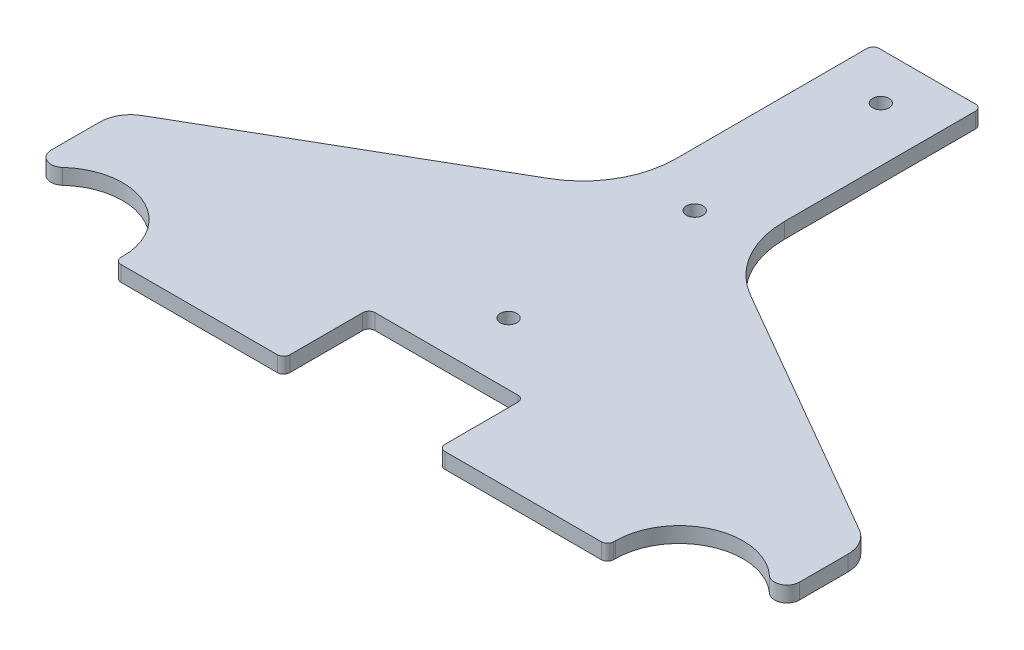
ISO-10303-21;
HEADER;
FILE_DESCRIPTION(('STEP AP214'),'2;1');
FILE_NAME('part.step','',(''),(''),'','','');
FILE_SCHEMA(('AUTOMOTIVE_DESIGN { 1 0 10303 214 1 1 1 1 }'));
ENDSEC;
DATA;
#1=APPLICATION_CONTEXT('core data for automotive mechanical design processes');
#2=APPLICATION_PROTOCOL_DEFINITION('international standard','automotive_design',2000,#1);
#3=PRODUCT_CONTEXT('',#1,'mechanical');
#4=PRODUCT('Part','Part','',(#3));
#5=PRODUCT_RELATED_PRODUCT_CATEGORY('part','',(#4));
#6=PRODUCT_DEFINITION_FORMATION('','',#4);
#7=PRODUCT_DEFINITION_CONTEXT('part definition',#1,'design');
#8=PRODUCT_DEFINITION('design','',#6,#7);
#9=PRODUCT_DEFINITION_SHAPE('','',#8);
#10=(LENGTH_UNIT() NAMED_UNIT(*) SI_UNIT(.MILLI.,.METRE.));
#11=(NAMED_UNIT(*) PLANE_ANGLE_UNIT() SI_UNIT($,.RADIAN.));
#12=(NAMED_UNIT(*) SI_UNIT($,.STERADIAN.) SOLID_ANGLE_UNIT());
#13=UNCERTAINTY_MEASURE_WITH_UNIT(LENGTH_MEASURE(1.E-05),#10,'distance_accuracy_value','');
#14=(GEOMETRIC_REPRESENTATION_CONTEXT(3) GLOBAL_UNCERTAINTY_ASSIGNED_CONTEXT((#13)) GLOBAL_UNIT_ASSIGNED_CONTEXT((#10,
#11,#12)) REPRESENTATION_CONTEXT('',''));
#15=CARTESIAN_POINT('',(0.,0.,0.));
#16=DIRECTION('',(0.,0.,1.));
#17=DIRECTION('',(1.,0.,0.));
#18=AXIS2_PLACEMENT_3D('',#15,#16,#17);
#19=CARTESIAN_POINT('',(-100.838,6.35,3.175));
#20=DIRECTION('',(0.,0.,-1.));
#21=DIRECTION('',(-1.,0.,0.));
#22=AXIS2_PLACEMENT_3D('',#19,#20,#21);
#23=PLANE('',#22);
#24=DIRECTION('',(1.,0.,0.));
#25=VECTOR('',#24,1.);
#26=CARTESIAN_POINT('',(-100.838,6.35,3.175));
#27=LINE('',#26,#25);
#28=CARTESIAN_POINT('',(-98.298,6.35,3.175));
#29=VERTEX_POINT('',#28);
#30=CARTESIAN_POINT('',(-34.29,6.35,3.175));
#31=VERTEX_POINT('',#30);
#32=EDGE_CURVE('E263',#29,#31,#27,.T.);
#33=ORIENTED_EDGE('',*,*,#32,.F.);
#34=DIRECTION('',(0.,-1.,0.));
#35=VECTOR('',#34,1.);
#36=CARTESIAN_POINT('',(-98.298,6.35,3.175));
#37=LINE('',#36,#35);
#38=CARTESIAN_POINT('',(-98.298,0.,3.175));
#39=VERTEX_POINT('',#38);
#40=EDGE_CURVE('E355',#29,#39,#37,.T.);
#41=ORIENTED_EDGE('',*,*,#40,.T.);
#42=DIRECTION('',(1.,0.,0.));
#43=VECTOR('',#42,1.);
#44=CARTESIAN_POINT('',(-100.838,0.,3.175));
#45=LINE('',#44,#43);
#46=CARTESIAN_POINT('',(-34.29,0.,3.175));
#47=VERTEX_POINT('',#46);
#48=EDGE_CURVE('E286',#39,#47,#45,.T.);
#49=ORIENTED_EDGE('',*,*,#48,.T.);
#50=DIRECTION('',(0.,1.,0.));
#51=VECTOR('',#50,1.);
#52=CARTESIAN_POINT('',(-34.29,6.35,3.175));
#53=LINE('',#52,#51);
#54=EDGE_CURVE('E352',#47,#31,#53,.T.);
#55=ORIENTED_EDGE('',*,*,#54,.T.);
#56=EDGE_LOOP('',(#33,#41,#49,#55));
#57=FACE_BOUND('',#56,.T.);
#58=ADVANCED_FACE('F35',(#57),#23,.F.);
#59=CARTESIAN_POINT('',(-22.225,6.35,-228.6));
#60=DIRECTION('',(1.,0.,0.));
#61=DIRECTION('',(0.,0.,-1.));
#62=AXIS2_PLACEMENT_3D('',#59,#60,#61);
#63=PLANE('',#62);
#64=DIRECTION('',(0.,0.,1.));
#65=VECTOR('',#64,1.);
#66=CARTESIAN_POINT('',(-22.225,0.,-228.6));
#67=LINE('',#66,#65);
#68=CARTESIAN_POINT('',(-22.225,0.,-226.06));
#69=VERTEX_POINT('',#68);
#70=CARTESIAN_POINT('',(-22.225,0.,-147.854946515533));
#71=VERTEX_POINT('',#70);
#72=EDGE_CURVE('E278',#69,#71,#67,.T.);
#73=ORIENTED_EDGE('',*,*,#72,.T.);
#74=DIRECTION('',(0.,1.,0.));
#75=VECTOR('',#74,1.);
#76=CARTESIAN_POINT('',(-22.225,6.35,-147.854946515533));
#77=LINE('',#76,#75);
#78=CARTESIAN_POINT('',(-22.225,6.35,-147.854946515533));
#79=VERTEX_POINT('',#78);
#80=EDGE_CURVE('E418',#71,#79,#77,.T.);
#81=ORIENTED_EDGE('',*,*,#80,.T.);
#82=DIRECTION('',(0.,0.,1.));
#83=VECTOR('',#82,1.);
#84=CARTESIAN_POINT('',(-22.225,6.35,-228.6));
#85=LINE('',#84,#83);
#86=CARTESIAN_POINT('',(-22.225,6.35,-226.06));
#87=VERTEX_POINT('',#86);
#88=EDGE_CURVE('E244',#87,#79,#85,.T.);
#89=ORIENTED_EDGE('',*,*,#88,.F.);
#90=DIRECTION('',(0.,-1.,0.));
#91=VECTOR('',#90,1.);
#92=CARTESIAN_POINT('',(-22.225,6.35,-226.06));
#93=LINE('',#92,#91);
#94=EDGE_CURVE('E367',#87,#69,#93,.T.);
#95=ORIENTED_EDGE('',*,*,#94,.T.);
#96=EDGE_LOOP('',(#73,#81,#89,#95));
#97=FACE_BOUND('',#96,.T.);
#98=ADVANCED_FACE('F463',(#97),#63,.F.);
#99=CARTESIAN_POINT('',(-127.,6.35,0.));
#100=DIRECTION('',(0.,-1.,0.));
#101=DIRECTION('',(0.,0.,-1.));
#102=AXIS2_PLACEMENT_3D('',#99,#100,#101);
#103=CYLINDRICAL_SURFACE('',#102,26.162);
#104=CARTESIAN_POINT('',(-127.,6.35,0.));
#105=DIRECTION('',(0.,-1.,0.));
#106=DIRECTION('',(0.,0.,-1.));
#107=AXIS2_PLACEMENT_3D('',#104,#105,#106);
#108=CIRCLE('',#107,26.162);
#109=CARTESIAN_POINT('',(-144.654032520325,6.35,-19.3076508092336));
#110=VERTEX_POINT('',#109);
#111=CARTESIAN_POINT('',(-100.838,6.35,0.));
#112=VERTEX_POINT('',#111);
#113=EDGE_CURVE('E231',#110,#112,#108,.T.);
#114=ORIENTED_EDGE('',*,*,#113,.F.);
#115=DIRECTION('',(0.,-1.,0.));
#116=VECTOR('',#115,1.);
#117=CARTESIAN_POINT('',(-144.654032520325,6.35,-19.3076508092336));
#118=LINE('',#117,#116);
#119=CARTESIAN_POINT('',(-144.654032520325,0.,-19.3076508092336));
#120=VERTEX_POINT('',#119);
#121=EDGE_CURVE('E316',#110,#120,#118,.T.);
#122=ORIENTED_EDGE('',*,*,#121,.T.);
#123=CARTESIAN_POINT('',(-127.,0.,0.));
#124=DIRECTION('',(0.,-1.,0.));
#125=DIRECTION('',(0.,0.,-1.));
#126=AXIS2_PLACEMENT_3D('',#123,#124,#125);
#127=CIRCLE('',#126,26.162);
#128=CARTESIAN_POINT('',(-100.838,0.,0.));
#129=VERTEX_POINT('',#128);
#130=EDGE_CURVE('E250',#120,#129,#127,.T.);
#131=ORIENTED_EDGE('',*,*,#130,.T.);
#132=DIRECTION('',(0.,-1.,0.));
#133=VECTOR('',#132,1.);
#134=CARTESIAN_POINT('',(-100.838,6.35,0.));
#135=LINE('',#134,#133);
#136=EDGE_CURVE('E247',#112,#129,#135,.T.);
#137=ORIENTED_EDGE('',*,*,#136,.F.);
#138=EDGE_LOOP('',(#114,#122,#131,#137));
#139=FACE_BOUND('',#138,.T.);
#140=ADVANCED_FACE('F248',(#139),#103,.F.);
#141=CARTESIAN_POINT('',(-100.838,6.35,0.));
#142=DIRECTION('',(1.,0.,0.));
#143=DIRECTION('',(0.,0.,-1.));
#144=AXIS2_PLACEMENT_3D('',#141,#142,#143);
#145=PLANE('',#144);
#146=DIRECTION('',(0.,0.,1.));
#147=VECTOR('',#146,1.);
#148=CARTESIAN_POINT('',(-100.838,0.,0.));
#149=LINE('',#148,#147);
#150=CARTESIAN_POINT('',(-100.838,0.,0.635));
#151=VERTEX_POINT('',#150);
#152=EDGE_CURVE('E283',#129,#151,#149,.T.);
#153=ORIENTED_EDGE('',*,*,#152,.T.);
#154=DIRECTION('',(0.,-1.,0.));
#155=VECTOR('',#154,1.);
#156=CARTESIAN_POINT('',(-100.838,6.35,0.635));
#157=LINE('',#156,#155);
#158=CARTESIAN_POINT('',(-100.838,6.35,0.635));
#159=VERTEX_POINT('',#158);
#160=EDGE_CURVE('E259',#151,#159,#157,.F.);
#161=ORIENTED_EDGE('',*,*,#160,.T.);
#162=DIRECTION('',(0.,0.,1.));
#163=VECTOR('',#162,1.);
#164=CARTESIAN_POINT('',(-100.838,6.35,0.));
#165=LINE('',#164,#163);
#166=EDGE_CURVE('E236',#112,#159,#165,.T.);
#167=ORIENTED_EDGE('',*,*,#166,.F.);
#168=ORIENTED_EDGE('',*,*,#136,.T.);
#169=EDGE_LOOP('',(#153,#161,#167,#168));
#170=FACE_BOUND('',#169,.T.);
#171=ADVANCED_FACE('F257',(#170),#145,.F.);
#172=CARTESIAN_POINT('',(34.29,0.,3.175));
#173=VERTEX_POINT('',#172);
#174=CARTESIAN_POINT('',(98.298,0.,3.175));
#175=VERTEX_POINT('',#174);
#176=EDGE_CURVE('E285',#173,#175,#45,.T.);
#177=ORIENTED_EDGE('',*,*,#176,.T.);
#178=DIRECTION('',(0.,-1.,0.));
#179=VECTOR('',#178,1.);
#180=CARTESIAN_POINT('',(98.298,6.35,3.175));
#181=LINE('',#180,#179);
#182=CARTESIAN_POINT('',(98.298,6.35,3.175));
#183=VERTEX_POINT('',#182);
#184=EDGE_CURVE('E338',#175,#183,#181,.F.);
#185=ORIENTED_EDGE('',*,*,#184,.T.);
#186=CARTESIAN_POINT('',(34.29,6.35,3.175));
#187=VERTEX_POINT('',#186);
#188=EDGE_CURVE('E260',#187,#183,#27,.T.);
#189=ORIENTED_EDGE('',*,*,#188,.F.);
#190=DIRECTION('',(0.,1.,0.));
#191=VECTOR('',#190,1.);
#192=CARTESIAN_POINT('',(34.29,6.35,3.175));
#193=LINE('',#192,#191);
#194=EDGE_CURVE('E336',#187,#173,#193,.F.);
#195=ORIENTED_EDGE('',*,*,#194,.T.);
#196=EDGE_LOOP('',(#177,#185,#189,#195));
#197=FACE_BOUND('',#196,.T.);
#198=ADVANCED_FACE('F524',(#197),#23,.F.);
#199=CARTESIAN_POINT('',(100.838,6.35,0.));
#200=DIRECTION('',(-1.,0.,0.));
#201=DIRECTION('',(0.,0.,1.));
#202=AXIS2_PLACEMENT_3D('',#199,#200,#201);
#203=PLANE('',#202);
#204=DIRECTION('',(0.,0.,-1.));
#205=VECTOR('',#204,1.);
#206=CARTESIAN_POINT('',(100.838,6.35,0.));
#207=LINE('',#206,#205);
#208=CARTESIAN_POINT('',(100.838,6.35,0.635));
#209=VERTEX_POINT('',#208);
#210=CARTESIAN_POINT('',(100.838,6.35,0.));
#211=VERTEX_POINT('',#210);
#212=EDGE_CURVE('E268',#209,#211,#207,.T.);
#213=ORIENTED_EDGE('',*,*,#212,.F.);
#214=DIRECTION('',(0.,-1.,0.));
#215=VECTOR('',#214,1.);
#216=CARTESIAN_POINT('',(100.838,6.35,0.635));
#217=LINE('',#216,#215);
#218=CARTESIAN_POINT('',(100.838,0.,0.635));
#219=VERTEX_POINT('',#218);
#220=EDGE_CURVE('E320',#209,#219,#217,.T.);
#221=ORIENTED_EDGE('',*,*,#220,.T.);
#222=DIRECTION('',(0.,0.,-1.));
#223=VECTOR('',#222,1.);
#224=CARTESIAN_POINT('',(100.838,0.,0.));
#225=LINE('',#224,#223);
#226=CARTESIAN_POINT('',(100.838,0.,0.));
#227=VERTEX_POINT('',#226);
#228=EDGE_CURVE('E289',#219,#227,#225,.T.);
#229=ORIENTED_EDGE('',*,*,#228,.T.);
#230=DIRECTION('',(0.,-1.,0.));
#231=VECTOR('',#230,1.);
#232=CARTESIAN_POINT('',(100.838,6.35,0.));
#233=LINE('',#232,#231);
#234=EDGE_CURVE('E255',#211,#227,#233,.T.);
#235=ORIENTED_EDGE('',*,*,#234,.F.);
#236=EDGE_LOOP('',(#213,#221,#229,#235));
#237=FACE_BOUND('',#236,.T.);
#238=ADVANCED_FACE('F533',(#237),#203,.F.);
#239=CARTESIAN_POINT('',(127.,6.35,0.));
#240=DIRECTION('',(0.,-1.,0.));
#241=DIRECTION('',(0.,0.,-1.));
#242=AXIS2_PLACEMENT_3D('',#239,#240,#241);
#243=CYLINDRICAL_SURFACE('',#242,26.162);
#244=CARTESIAN_POINT('',(127.,0.,0.));
#245=DIRECTION('',(0.,-1.,0.));
#246=DIRECTION('',(0.,0.,1.));
#247=AXIS2_PLACEMENT_3D('',#244,#245,#246);
#248=CIRCLE('',#247,26.162);
#249=CARTESIAN_POINT('',(144.654032520325,0.,-19.3076508092336));
#250=VERTEX_POINT('',#249);
#251=EDGE_CURVE('E291',#227,#250,#248,.T.);
#252=ORIENTED_EDGE('',*,*,#251,.T.);
#253=DIRECTION('',(0.,-1.,0.));
#254=VECTOR('',#253,1.);
#255=CARTESIAN_POINT('',(144.654032520325,6.35,-19.3076508092336));
#256=LINE('',#255,#254);
#257=CARTESIAN_POINT('',(144.654032520325,6.35,-19.3076508092336));
#258=VERTEX_POINT('',#257);
#259=EDGE_CURVE('E310',#250,#258,#256,.F.);
#260=ORIENTED_EDGE('',*,*,#259,.T.);
#261=CARTESIAN_POINT('',(127.,6.35,0.));
#262=DIRECTION('',(0.,-1.,0.));
#263=DIRECTION('',(0.,0.,1.));
#264=AXIS2_PLACEMENT_3D('',#261,#262,#263);
#265=CIRCLE('',#264,26.162);
#266=EDGE_CURVE('E270',#211,#258,#265,.T.);
#267=ORIENTED_EDGE('',*,*,#266,.F.);
#268=ORIENTED_EDGE('',*,*,#234,.T.);
#269=EDGE_LOOP('',(#252,#260,#267,#268));
#270=FACE_BOUND('',#269,.T.);
#271=ADVANCED_FACE('F539',(#270),#243,.F.);
#272=CARTESIAN_POINT('',(22.225,6.35,-228.6));
#273=DIRECTION('',(-1.,0.,0.));
#274=DIRECTION('',(0.,0.,1.));
#275=AXIS2_PLACEMENT_3D('',#272,#273,#274);
#276=PLANE('',#275);
#277=DIRECTION('',(0.,0.,-1.));
#278=VECTOR('',#277,1.);
#279=CARTESIAN_POINT('',(22.225,6.35,-228.6));
#280=LINE('',#279,#278);
#281=CARTESIAN_POINT('',(22.225,6.35,-147.854946515533));
#282=VERTEX_POINT('',#281);
#283=CARTESIAN_POINT('',(22.225,6.35,-226.06));
#284=VERTEX_POINT('',#283);
#285=EDGE_CURVE('E273',#282,#284,#280,.T.);
#286=ORIENTED_EDGE('',*,*,#285,.F.);
#287=DIRECTION('',(0.,1.,0.));
#288=VECTOR('',#287,1.);
#289=CARTESIAN_POINT('',(22.225,0.,-147.854946515533));
#290=LINE('',#289,#288);
#291=CARTESIAN_POINT('',(22.225,0.,-147.854946515533));
#292=VERTEX_POINT('',#291);
#293=EDGE_CURVE('E416',#282,#292,#290,.F.);
#294=ORIENTED_EDGE('',*,*,#293,.T.);
#295=DIRECTION('',(0.,0.,-1.));
#296=VECTOR('',#295,1.);
#297=CARTESIAN_POINT('',(22.225,0.,-228.6));
#298=LINE('',#297,#296);
#299=CARTESIAN_POINT('',(22.225,0.,-226.06));
#300=VERTEX_POINT('',#299);
#301=EDGE_CURVE('E294',#292,#300,#298,.T.);
#302=ORIENTED_EDGE('',*,*,#301,.T.);
#303=DIRECTION('',(0.,-1.,0.));
#304=VECTOR('',#303,1.);
#305=CARTESIAN_POINT('',(22.225,6.35,-226.06));
#306=LINE('',#305,#304);
#307=EDGE_CURVE('E364',#300,#284,#306,.F.);
#308=ORIENTED_EDGE('',*,*,#307,.T.);
#309=EDGE_LOOP('',(#286,#294,#302,#308));
#310=FACE_BOUND('',#309,.T.);
#311=ADVANCED_FACE('F446',(#310),#276,.F.);
#312=CARTESIAN_POINT('',(22.225,6.35,-228.6));
#313=DIRECTION('',(0.,0.,1.));
#314=DIRECTION('',(1.,0.,0.));
#315=AXIS2_PLACEMENT_3D('',#312,#313,#314);
#316=PLANE('',#315);
#317=DIRECTION('',(-1.,0.,0.));
#318=VECTOR('',#317,1.);
#319=CARTESIAN_POINT('',(22.225,6.35,-228.6));
#320=LINE('',#319,#318);
#321=CARTESIAN_POINT('',(19.685,6.35,-228.6));
#322=VERTEX_POINT('',#321);
#323=CARTESIAN_POINT('',(-19.685,6.35,-228.6));
#324=VERTEX_POINT('',#323);
#325=EDGE_CURVE('E275',#322,#324,#320,.T.);
#326=ORIENTED_EDGE('',*,*,#325,.F.);
#327=DIRECTION('',(0.,-1.,0.));
#328=VECTOR('',#327,1.);
#329=CARTESIAN_POINT('',(19.685,6.35,-228.6));
#330=LINE('',#329,#328);
#331=CARTESIAN_POINT('',(19.685,0.,-228.6));
#332=VERTEX_POINT('',#331);
#333=EDGE_CURVE('E361',#322,#332,#330,.T.);
#334=ORIENTED_EDGE('',*,*,#333,.T.);
#335=DIRECTION('',(-1.,0.,0.));
#336=VECTOR('',#335,1.);
#337=CARTESIAN_POINT('',(22.225,0.,-228.6));
#338=LINE('',#337,#336);
#339=CARTESIAN_POINT('',(-19.685,0.,-228.6));
#340=VERTEX_POINT('',#339);
#341=EDGE_CURVE('E296',#332,#340,#338,.T.);
#342=ORIENTED_EDGE('',*,*,#341,.T.);
#343=DIRECTION('',(0.,-1.,0.));
#344=VECTOR('',#343,1.);
#345=CARTESIAN_POINT('',(-19.685,6.35,-228.6));
#346=LINE('',#345,#344);
#347=EDGE_CURVE('E359',#340,#324,#346,.F.);
#348=ORIENTED_EDGE('',*,*,#347,.T.);
#349=EDGE_LOOP('',(#326,#334,#342,#348));
#350=FACE_BOUND('',#349,.T.);
#351=ADVANCED_FACE('F455',(#350),#316,.F.);
#352=CARTESIAN_POINT('',(-60.325,6.35,-190.5));
#353=DIRECTION('',(0.,-1.,0.));
#354=DIRECTION('',(0.,0.,-1.));
#355=AXIS2_PLACEMENT_3D('',#352,#353,#354);
#356=PLANE('',#355);
#357=CARTESIAN_POINT('',(0.,6.35,-209.55));
#358=DIRECTION('',(0.,1.,0.));
#359=DIRECTION('',(0.,0.,1.));
#360=AXIS2_PLACEMENT_3D('',#357,#358,#359);
#361=CIRCLE('',#360,3.37819999999999);
#362=CARTESIAN_POINT('',(0.,6.35,-206.1718));
#363=VERTEX_POINT('',#362);
#364=EDGE_CURVE('E499',#363,#363,#361,.T.);
#365=ORIENTED_EDGE('',*,*,#364,.F.);
#366=EDGE_LOOP('',(#365));
#367=FACE_BOUND('',#366,.T.);
#368=CARTESIAN_POINT('',(0.,6.35,-133.35));
#369=DIRECTION('',(0.,1.,0.));
#370=DIRECTION('',(0.,0.,1.));
#371=AXIS2_PLACEMENT_3D('',#368,#369,#370);
#372=CIRCLE('',#371,3.37819999999999);
#373=CARTESIAN_POINT('',(0.,6.35,-129.9718));
#374=VERTEX_POINT('',#373);
#375=EDGE_CURVE('E493',#374,#374,#372,.T.);
#376=ORIENTED_EDGE('',*,*,#375,.F.);
#377=EDGE_LOOP('',(#376));
#378=FACE_BOUND('',#377,.T.);
#379=CARTESIAN_POINT('',(0.,6.35,-57.15));
#380=DIRECTION('',(0.,1.,0.));
#381=DIRECTION('',(0.,0.,1.));
#382=AXIS2_PLACEMENT_3D('',#379,#380,#381);
#383=CIRCLE('',#382,3.37819999999999);
#384=CARTESIAN_POINT('',(0.,6.35,-53.7718));
#385=VERTEX_POINT('',#384);
#386=EDGE_CURVE('E487',#385,#385,#383,.T.);
#387=ORIENTED_EDGE('',*,*,#386,.F.);
#388=EDGE_LOOP('',(#387));
#389=FACE_BOUND('',#388,.T.);
#390=DIRECTION('',(0.,0.,1.));
#391=VECTOR('',#390,1.);
#392=CARTESIAN_POINT('',(153.162,6.35,3.17499999999996));
#393=LINE('',#392,#391);
#394=CARTESIAN_POINT('',(153.162,6.35,-42.9290406438181));
#395=VERTEX_POINT('',#394);
#396=CARTESIAN_POINT('',(153.162,6.35,-23.0567092187935));
#397=VERTEX_POINT('',#396);
#398=EDGE_CURVE('E503',#395,#397,#393,.T.);
#399=ORIENTED_EDGE('',*,*,#398,.F.);
#400=CARTESIAN_POINT('',(140.462,6.35,-42.9290406438181));
#401=DIRECTION('',(0.,-1.,0.));
#402=DIRECTION('',(0.,0.,-1.));
#403=AXIS2_PLACEMENT_3D('',#400,#401,#402);
#404=CIRCLE('',#403,12.7);
#405=CARTESIAN_POINT('',(146.812,6.35,-53.9275632718805));
#406=VERTEX_POINT('',#405);
#407=EDGE_CURVE('E398',#395,#406,#404,.F.);
#408=ORIENTED_EDGE('',*,*,#407,.T.);
#409=DIRECTION('',(0.866025403784439,0.,0.5));
#410=VECTOR('',#409,1.);
#411=CARTESIAN_POINT('',(22.225,6.35,-125.857901259408));
#412=LINE('',#411,#410);
#413=CARTESIAN_POINT('',(41.275,6.35,-114.859378631346));
#414=VERTEX_POINT('',#413);
#415=EDGE_CURVE('E441',#414,#406,#412,.T.);
#416=ORIENTED_EDGE('',*,*,#415,.F.);
#417=CARTESIAN_POINT('',(60.325,6.35,-147.854946515533));
#418=DIRECTION('',(0.,-1.,0.));
#419=DIRECTION('',(0.,0.,-1.));
#420=AXIS2_PLACEMENT_3D('',#417,#418,#419);
#421=CIRCLE('',#420,38.1);
#422=EDGE_CURVE('E422',#414,#282,#421,.T.);
#423=ORIENTED_EDGE('',*,*,#422,.T.);
#424=ORIENTED_EDGE('',*,*,#285,.T.);
#425=CARTESIAN_POINT('',(19.685,6.35,-226.06));
#426=DIRECTION('',(0.,-1.,0.));
#427=DIRECTION('',(0.,0.,-1.));
#428=AXIS2_PLACEMENT_3D('',#425,#426,#427);
#429=CIRCLE('',#428,2.54);
#430=EDGE_CURVE('E346',#284,#322,#429,.F.);
#431=ORIENTED_EDGE('',*,*,#430,.T.);
#432=ORIENTED_EDGE('',*,*,#325,.T.);
#433=CARTESIAN_POINT('',(-19.685,6.35,-226.06));
#434=DIRECTION('',(0.,-1.,0.));
#435=DIRECTION('',(0.,0.,-1.));
#436=AXIS2_PLACEMENT_3D('',#433,#434,#435);
#437=CIRCLE('',#436,2.54);
#438=EDGE_CURVE('E344',#324,#87,#437,.F.);
#439=ORIENTED_EDGE('',*,*,#438,.T.);
#440=ORIENTED_EDGE('',*,*,#88,.T.);
#441=CARTESIAN_POINT('',(-60.325,6.35,-147.854946515533));
#442=DIRECTION('',(0.,-1.,0.));
#443=DIRECTION('',(0.,0.,-1.));
#444=AXIS2_PLACEMENT_3D('',#441,#442,#443);
#445=CIRCLE('',#444,38.1);
#446=CARTESIAN_POINT('',(-41.275,6.35,-114.859378631346));
#447=VERTEX_POINT('',#446);
#448=EDGE_CURVE('E43',#79,#447,#445,.T.);
#449=ORIENTED_EDGE('',*,*,#448,.T.);
#450=DIRECTION('',(0.866025403784439,0.,-0.5));
#451=VECTOR('',#450,1.);
#452=CARTESIAN_POINT('',(-22.225,6.35,-125.857901259408));
#453=LINE('',#452,#451);
#454=CARTESIAN_POINT('',(-146.812,6.35,-53.9275632718805));
#455=VERTEX_POINT('',#454);
#456=EDGE_CURVE('E440',#455,#447,#453,.T.);
#457=ORIENTED_EDGE('',*,*,#456,.F.);
#458=CARTESIAN_POINT('',(-140.462,6.35,-42.9290406438181));
#459=DIRECTION('',(0.,-1.,0.));
#460=DIRECTION('',(0.,0.,-1.));
#461=AXIS2_PLACEMENT_3D('',#458,#459,#460);
#462=CIRCLE('',#461,12.7);
#463=CARTESIAN_POINT('',(-153.162,6.35,-42.9290406438181));
#464=VERTEX_POINT('',#463);
#465=EDGE_CURVE('E396',#455,#464,#462,.F.);
#466=ORIENTED_EDGE('',*,*,#465,.T.);
#467=DIRECTION('',(0.,0.,-1.));
#468=VECTOR('',#467,1.);
#469=CARTESIAN_POINT('',(-153.162,6.35,3.175));
#470=LINE('',#469,#468);
#471=CARTESIAN_POINT('',(-153.162,6.35,-23.0567092187936));
#472=VERTEX_POINT('',#471);
#473=EDGE_CURVE('E502',#472,#464,#470,.T.);
#474=ORIENTED_EDGE('',*,*,#473,.F.);
#475=CARTESIAN_POINT('',(-148.082,6.35,-23.0567092187936));
#476=DIRECTION('',(0.,-1.,0.));
#477=DIRECTION('',(0.,0.,-1.));
#478=AXIS2_PLACEMENT_3D('',#475,#476,#477);
#479=CIRCLE('',#478,5.07999999999999);
#480=EDGE_CURVE('E240',#472,#110,#479,.F.);
#481=ORIENTED_EDGE('',*,*,#480,.T.);
#482=ORIENTED_EDGE('',*,*,#113,.T.);
#483=ORIENTED_EDGE('',*,*,#166,.T.);
#484=CARTESIAN_POINT('',(-98.298,6.35,0.635));
#485=DIRECTION('',(0.,-1.,0.));
#486=DIRECTION('',(0.,0.,-1.));
#487=AXIS2_PLACEMENT_3D('',#484,#485,#486);
#488=CIRCLE('',#487,2.54);
#489=EDGE_CURVE('E348',#159,#29,#488,.F.);
#490=ORIENTED_EDGE('',*,*,#489,.T.);
#491=ORIENTED_EDGE('',*,*,#32,.T.);
#492=CARTESIAN_POINT('',(-34.29,6.35,0.635));
#493=DIRECTION('',(0.,-1.,0.));
#494=DIRECTION('',(0.,0.,-1.));
#495=AXIS2_PLACEMENT_3D('',#492,#493,#494);
#496=CIRCLE('',#495,2.54);
#497=CARTESIAN_POINT('',(-31.75,6.35,0.635));
#498=VERTEX_POINT('',#497);
#499=EDGE_CURVE('E340',#31,#498,#496,.F.);
#500=ORIENTED_EDGE('',*,*,#499,.T.);
#501=DIRECTION('',(0.,0.,1.));
#502=VECTOR('',#501,1.);
#503=CARTESIAN_POINT('',(-31.75,6.35,3.175));
#504=LINE('',#503,#502);
#505=CARTESIAN_POINT('',(-31.75,6.35,-29.21));
#506=VERTEX_POINT('',#505);
#507=EDGE_CURVE('E467',#506,#498,#504,.T.);
#508=ORIENTED_EDGE('',*,*,#507,.F.);
#509=CARTESIAN_POINT('',(-29.21,6.35,-29.21));
#510=DIRECTION('',(0.,-1.,0.));
#511=DIRECTION('',(0.,0.,-1.));
#512=AXIS2_PLACEMENT_3D('',#509,#510,#511);
#513=CIRCLE('',#512,2.54);
#514=CARTESIAN_POINT('',(-29.21,6.35,-31.75));
#515=VERTEX_POINT('',#514);
#516=EDGE_CURVE('E389',#506,#515,#513,.T.);
#517=ORIENTED_EDGE('',*,*,#516,.T.);
#518=DIRECTION('',(-1.,0.,0.));
#519=VECTOR('',#518,1.);
#520=CARTESIAN_POINT('',(-31.75,6.35,-31.75));
#521=LINE('',#520,#519);
#522=CARTESIAN_POINT('',(29.21,6.35,-31.75));
#523=VERTEX_POINT('',#522);
#524=EDGE_CURVE('E471',#523,#515,#521,.T.);
#525=ORIENTED_EDGE('',*,*,#524,.F.);
#526=CARTESIAN_POINT('',(29.21,6.35,-29.21));
#527=DIRECTION('',(0.,-1.,0.));
#528=DIRECTION('',(0.,0.,-1.));
#529=AXIS2_PLACEMENT_3D('',#526,#527,#528);
#530=CIRCLE('',#529,2.54);
#531=CARTESIAN_POINT('',(31.75,6.35,-29.21));
#532=VERTEX_POINT('',#531);
#533=EDGE_CURVE('E385',#523,#532,#530,.T.);
#534=ORIENTED_EDGE('',*,*,#533,.T.);
#535=DIRECTION('',(0.,0.,-1.));
#536=VECTOR('',#535,1.);
#537=CARTESIAN_POINT('',(31.75,6.35,-31.75));
#538=LINE('',#537,#536);
#539=CARTESIAN_POINT('',(31.75,6.35,0.634999999999997));
#540=VERTEX_POINT('',#539);
#541=EDGE_CURVE('E474',#540,#532,#538,.T.);
#542=ORIENTED_EDGE('',*,*,#541,.F.);
#543=CARTESIAN_POINT('',(34.29,6.35,0.634999999999997));
#544=DIRECTION('',(0.,-1.,0.));
#545=DIRECTION('',(0.,0.,-1.));
#546=AXIS2_PLACEMENT_3D('',#543,#544,#545);
#547=CIRCLE('',#546,2.54);
#548=EDGE_CURVE('E342',#540,#187,#547,.F.);
#549=ORIENTED_EDGE('',*,*,#548,.T.);
#550=ORIENTED_EDGE('',*,*,#188,.T.);
#551=CARTESIAN_POINT('',(98.298,6.35,0.635));
#552=DIRECTION('',(0.,-1.,0.));
#553=DIRECTION('',(0.,0.,-1.));
#554=AXIS2_PLACEMENT_3D('',#551,#552,#553);
#555=CIRCLE('',#554,2.54);
#556=EDGE_CURVE('E350',#183,#209,#555,.F.);
#557=ORIENTED_EDGE('',*,*,#556,.T.);
#558=ORIENTED_EDGE('',*,*,#212,.T.);
#559=ORIENTED_EDGE('',*,*,#266,.T.);
#560=CARTESIAN_POINT('',(148.082,6.35,-23.0567092187935));
#561=DIRECTION('',(0.,-1.,0.));
#562=DIRECTION('',(0.,0.,-1.));
#563=AXIS2_PLACEMENT_3D('',#560,#561,#562);
#564=CIRCLE('',#563,5.07999999999999);
#565=EDGE_CURVE('E313',#258,#397,#564,.F.);
#566=ORIENTED_EDGE('',*,*,#565,.T.);
#567=EDGE_LOOP('',(#399,#408,#416,#423,#424,#431,#432,#439,#440,#449,#457,#466,#474,#481,#482,
#483,#490,#491,#500,#508,#517,#525,#534,#542,#549,#550,#557,#558,#559,#566));
#568=FACE_BOUND('',#567,.T.);
#569=ADVANCED_FACE('F234',(#367,#378,#389,#568),#356,.F.);
#570=CARTESIAN_POINT('',(-60.325,0.,-190.5));
#571=DIRECTION('',(0.,-1.,0.));
#572=DIRECTION('',(0.,0.,-1.));
#573=AXIS2_PLACEMENT_3D('',#570,#571,#572);
#574=PLANE('',#573);
#575=ORIENTED_EDGE('',*,*,#301,.F.);
#576=CARTESIAN_POINT('',(60.325,0.,-147.854946515533));
#577=DIRECTION('',(0.,-1.,0.));
#578=DIRECTION('',(0.,0.,-1.));
#579=AXIS2_PLACEMENT_3D('',#576,#577,#578);
#580=CIRCLE('',#579,38.1);
#581=CARTESIAN_POINT('',(41.275,0.,-114.859378631346));
#582=VERTEX_POINT('',#581);
#583=EDGE_CURVE('E424',#292,#582,#580,.F.);
#584=ORIENTED_EDGE('',*,*,#583,.T.);
#585=DIRECTION('',(0.866025403784439,0.,0.5));
#586=VECTOR('',#585,1.);
#587=CARTESIAN_POINT('',(22.225,0.,-125.857901259408));
#588=LINE('',#587,#586);
#589=CARTESIAN_POINT('',(146.812,0.,-53.9275632718805));
#590=VERTEX_POINT('',#589);
#591=EDGE_CURVE('E431',#582,#590,#588,.T.);
#592=ORIENTED_EDGE('',*,*,#591,.T.);
#593=CARTESIAN_POINT('',(140.462,0.,-42.9290406438181));
#594=DIRECTION('',(0.,-1.,0.));
#595=DIRECTION('',(0.,0.,-1.));
#596=AXIS2_PLACEMENT_3D('',#593,#594,#595);
#597=CIRCLE('',#596,12.7);
#598=CARTESIAN_POINT('',(153.162,0.,-42.9290406438181));
#599=VERTEX_POINT('',#598);
#600=EDGE_CURVE('E406',#590,#599,#597,.T.);
#601=ORIENTED_EDGE('',*,*,#600,.T.);
#602=DIRECTION('',(0.,0.,1.));
#603=VECTOR('',#602,1.);
#604=CARTESIAN_POINT('',(153.162,0.,3.17499999999996));
#605=LINE('',#604,#603);
#606=CARTESIAN_POINT('',(153.162,0.,-23.0567092187935));
#607=VERTEX_POINT('',#606);
#608=EDGE_CURVE('E505',#599,#607,#605,.T.);
#609=ORIENTED_EDGE('',*,*,#608,.T.);
#610=CARTESIAN_POINT('',(148.082,0.,-23.0567092187935));
#611=DIRECTION('',(0.,-1.,0.));
#612=DIRECTION('',(0.,0.,-1.));
#613=AXIS2_PLACEMENT_3D('',#610,#611,#612);
#614=CIRCLE('',#613,5.07999999999999);
#615=EDGE_CURVE('E308',#607,#250,#614,.T.);
#616=ORIENTED_EDGE('',*,*,#615,.T.);
#617=ORIENTED_EDGE('',*,*,#251,.F.);
#618=ORIENTED_EDGE('',*,*,#228,.F.);
#619=CARTESIAN_POINT('',(98.298,0.,0.635));
#620=DIRECTION('',(0.,-1.,0.));
#621=DIRECTION('',(0.,0.,-1.));
#622=AXIS2_PLACEMENT_3D('',#619,#620,#621);
#623=CIRCLE('',#622,2.54);
#624=EDGE_CURVE('E334',#219,#175,#623,.T.);
#625=ORIENTED_EDGE('',*,*,#624,.T.);
#626=ORIENTED_EDGE('',*,*,#176,.F.);
#627=CARTESIAN_POINT('',(34.29,0.,0.634999999999997));
#628=DIRECTION('',(0.,-1.,0.));
#629=DIRECTION('',(0.,0.,-1.));
#630=AXIS2_PLACEMENT_3D('',#627,#628,#629);
#631=CIRCLE('',#630,2.54);
#632=CARTESIAN_POINT('',(31.75,0.,0.634999999999997));
#633=VERTEX_POINT('',#632);
#634=EDGE_CURVE('E325',#173,#633,#631,.T.);
#635=ORIENTED_EDGE('',*,*,#634,.T.);
#636=DIRECTION('',(0.,0.,-1.));
#637=VECTOR('',#636,1.);
#638=CARTESIAN_POINT('',(31.75,0.,-31.75));
#639=LINE('',#638,#637);
#640=CARTESIAN_POINT('',(31.75,0.,-29.21));
#641=VERTEX_POINT('',#640);
#642=EDGE_CURVE('E470',#633,#641,#639,.T.);
#643=ORIENTED_EDGE('',*,*,#642,.T.);
#644=CARTESIAN_POINT('',(29.21,0.,-29.21));
#645=DIRECTION('',(0.,-1.,0.));
#646=DIRECTION('',(0.,0.,-1.));
#647=AXIS2_PLACEMENT_3D('',#644,#645,#646);
#648=CIRCLE('',#647,2.54);
#649=CARTESIAN_POINT('',(29.21,0.,-31.75));
#650=VERTEX_POINT('',#649);
#651=EDGE_CURVE('E387',#641,#650,#648,.F.);
#652=ORIENTED_EDGE('',*,*,#651,.T.);
#653=DIRECTION('',(-1.,0.,0.));
#654=VECTOR('',#653,1.);
#655=CARTESIAN_POINT('',(-31.75,0.,-31.75));
#656=LINE('',#655,#654);
#657=CARTESIAN_POINT('',(-29.21,0.,-31.75));
#658=VERTEX_POINT('',#657);
#659=EDGE_CURVE('E480',#650,#658,#656,.T.);
#660=ORIENTED_EDGE('',*,*,#659,.T.);
#661=CARTESIAN_POINT('',(-29.21,0.,-29.21));
#662=DIRECTION('',(0.,-1.,0.));
#663=DIRECTION('',(0.,0.,-1.));
#664=AXIS2_PLACEMENT_3D('',#661,#662,#663);
#665=CIRCLE('',#664,2.54);
#666=CARTESIAN_POINT('',(-31.75,0.,-29.21));
#667=VERTEX_POINT('',#666);
#668=EDGE_CURVE('E391',#658,#667,#665,.F.);
#669=ORIENTED_EDGE('',*,*,#668,.T.);
#670=DIRECTION('',(0.,0.,1.));
#671=VECTOR('',#670,1.);
#672=CARTESIAN_POINT('',(-31.75,0.,3.175));
#673=LINE('',#672,#671);
#674=CARTESIAN_POINT('',(-31.75,0.,0.635));
#675=VERTEX_POINT('',#674);
#676=EDGE_CURVE('E281',#667,#675,#673,.T.);
#677=ORIENTED_EDGE('',*,*,#676,.T.);
#678=CARTESIAN_POINT('',(-34.29,0.,0.635));
#679=DIRECTION('',(0.,-1.,0.));
#680=DIRECTION('',(0.,0.,-1.));
#681=AXIS2_PLACEMENT_3D('',#678,#679,#680);
#682=CIRCLE('',#681,2.54);
#683=EDGE_CURVE('E323',#675,#47,#682,.T.);
#684=ORIENTED_EDGE('',*,*,#683,.T.);
#685=ORIENTED_EDGE('',*,*,#48,.F.);
#686=CARTESIAN_POINT('',(-98.298,0.,0.635));
#687=DIRECTION('',(0.,-1.,0.));
#688=DIRECTION('',(0.,0.,-1.));
#689=AXIS2_PLACEMENT_3D('',#686,#687,#688);
#690=CIRCLE('',#689,2.54);
#691=EDGE_CURVE('E332',#39,#151,#690,.T.);
#692=ORIENTED_EDGE('',*,*,#691,.T.);
#693=ORIENTED_EDGE('',*,*,#152,.F.);
#694=ORIENTED_EDGE('',*,*,#130,.F.);
#695=CARTESIAN_POINT('',(-148.082,0.,-23.0567092187936));
#696=DIRECTION('',(0.,-1.,0.));
#697=DIRECTION('',(0.,0.,-1.));
#698=AXIS2_PLACEMENT_3D('',#695,#696,#697);
#699=CIRCLE('',#698,5.07999999999999);
#700=CARTESIAN_POINT('',(-153.162,0.,-23.0567092187935));
#701=VERTEX_POINT('',#700);
#702=EDGE_CURVE('E305',#120,#701,#699,.T.);
#703=ORIENTED_EDGE('',*,*,#702,.T.);
#704=DIRECTION('',(0.,0.,1.));
#705=VECTOR('',#704,1.);
#706=CARTESIAN_POINT('',(-153.162,0.,-190.5));
#707=LINE('',#706,#705);
#708=CARTESIAN_POINT('',(-153.162,0.,-42.9290406438181));
#709=VERTEX_POINT('',#708);
#710=EDGE_CURVE('E254',#709,#701,#707,.T.);
#711=ORIENTED_EDGE('',*,*,#710,.F.);
#712=CARTESIAN_POINT('',(-140.462,0.,-42.9290406438181));
#713=DIRECTION('',(0.,-1.,0.));
#714=DIRECTION('',(0.,0.,-1.));
#715=AXIS2_PLACEMENT_3D('',#712,#713,#714);
#716=CIRCLE('',#715,12.7);
#717=CARTESIAN_POINT('',(-146.812,0.,-53.9275632718805));
#718=VERTEX_POINT('',#717);
#719=EDGE_CURVE('E404',#709,#718,#716,.T.);
#720=ORIENTED_EDGE('',*,*,#719,.T.);
#721=DIRECTION('',(0.866025403784439,0.,-0.5));
#722=VECTOR('',#721,1.);
#723=CARTESIAN_POINT('',(-22.225,0.,-125.857901259408));
#724=LINE('',#723,#722);
#725=CARTESIAN_POINT('',(-41.275,0.,-114.859378631346));
#726=VERTEX_POINT('',#725);
#727=EDGE_CURVE('E506',#718,#726,#724,.T.);
#728=ORIENTED_EDGE('',*,*,#727,.T.);
#729=CARTESIAN_POINT('',(-60.325,0.,-147.854946515533));
#730=DIRECTION('',(0.,-1.,0.));
#731=DIRECTION('',(0.,0.,-1.));
#732=AXIS2_PLACEMENT_3D('',#729,#730,#731);
#733=CIRCLE('',#732,38.1);
#734=EDGE_CURVE('E11',#726,#71,#733,.F.);
#735=ORIENTED_EDGE('',*,*,#734,.T.);
#736=ORIENTED_EDGE('',*,*,#72,.F.);
#737=CARTESIAN_POINT('',(-19.685,0.,-226.06));
#738=DIRECTION('',(0.,-1.,0.));
#739=DIRECTION('',(0.,0.,-1.));
#740=AXIS2_PLACEMENT_3D('',#737,#738,#739);
#741=CIRCLE('',#740,2.54);
#742=EDGE_CURVE('E327',#69,#340,#741,.T.);
#743=ORIENTED_EDGE('',*,*,#742,.T.);
#744=ORIENTED_EDGE('',*,*,#341,.F.);
#745=CARTESIAN_POINT('',(19.685,0.,-226.06));
#746=DIRECTION('',(0.,-1.,0.));
#747=DIRECTION('',(0.,0.,-1.));
#748=AXIS2_PLACEMENT_3D('',#745,#746,#747);
#749=CIRCLE('',#748,2.54);
#750=EDGE_CURVE('E329',#332,#300,#749,.T.);
#751=ORIENTED_EDGE('',*,*,#750,.T.);
#752=EDGE_LOOP('',(#575,#584,#592,#601,#609,#616,#617,#618,#625,#626,#635,#643,#652,#660,#669,
#677,#684,#685,#692,#693,#694,#703,#711,#720,#728,#735,#736,#743,#744,#751));
#753=FACE_BOUND('',#752,.T.);
#754=CARTESIAN_POINT('',(0.,0.,-209.55));
#755=DIRECTION('',(0.,1.,0.));
#756=DIRECTION('',(0.,0.,1.));
#757=AXIS2_PLACEMENT_3D('',#754,#755,#756);
#758=CIRCLE('',#757,3.37819999999997);
#759=CARTESIAN_POINT('',(0.,0.,-206.1718));
#760=VERTEX_POINT('',#759);
#761=EDGE_CURVE('E496',#760,#760,#758,.T.);
#762=ORIENTED_EDGE('',*,*,#761,.T.);
#763=EDGE_LOOP('',(#762));
#764=FACE_BOUND('',#763,.T.);
#765=CARTESIAN_POINT('',(0.,0.,-133.35));
#766=DIRECTION('',(0.,1.,0.));
#767=DIRECTION('',(0.,0.,1.));
#768=AXIS2_PLACEMENT_3D('',#765,#766,#767);
#769=CIRCLE('',#768,3.37819999999997);
#770=CARTESIAN_POINT('',(0.,0.,-129.9718));
#771=VERTEX_POINT('',#770);
#772=EDGE_CURVE('E490',#771,#771,#769,.T.);
#773=ORIENTED_EDGE('',*,*,#772,.T.);
#774=EDGE_LOOP('',(#773));
#775=FACE_BOUND('',#774,.T.);
#776=CARTESIAN_POINT('',(0.,0.,-57.15));
#777=DIRECTION('',(0.,1.,0.));
#778=DIRECTION('',(0.,0.,1.));
#779=AXIS2_PLACEMENT_3D('',#776,#777,#778);
#780=CIRCLE('',#779,3.37819999999997);
#781=CARTESIAN_POINT('',(0.,0.,-53.7718));
#782=VERTEX_POINT('',#781);
#783=EDGE_CURVE('E477',#782,#782,#780,.T.);
#784=ORIENTED_EDGE('',*,*,#783,.T.);
#785=EDGE_LOOP('',(#784));
#786=FACE_BOUND('',#785,.T.);
#787=ADVANCED_FACE('F429',(#753,#764,#775,#786),#574,.T.);
#788=CARTESIAN_POINT('',(-31.75,0.,3.175));
#789=DIRECTION('',(-1.,0.,0.));
#790=DIRECTION('',(0.,0.,1.));
#791=AXIS2_PLACEMENT_3D('',#788,#789,#790);
#792=PLANE('',#791);
#793=ORIENTED_EDGE('',*,*,#676,.F.);
#794=DIRECTION('',(0.,1.,0.));
#795=VECTOR('',#794,1.);
#796=CARTESIAN_POINT('',(-31.75,6.35,-29.21));
#797=LINE('',#796,#795);
#798=EDGE_CURVE('E382',#667,#506,#797,.T.);
#799=ORIENTED_EDGE('',*,*,#798,.T.);
#800=ORIENTED_EDGE('',*,*,#507,.T.);
#801=DIRECTION('',(0.,1.,0.));
#802=VECTOR('',#801,1.);
#803=CARTESIAN_POINT('',(-31.75,0.,0.635));
#804=LINE('',#803,#802);
#805=EDGE_CURVE('E380',#498,#675,#804,.F.);
#806=ORIENTED_EDGE('',*,*,#805,.T.);
#807=EDGE_LOOP('',(#793,#799,#800,#806));
#808=FACE_BOUND('',#807,.T.);
#809=ADVANCED_FACE('F656',(#808),#792,.F.);
#810=CARTESIAN_POINT('',(-31.75,0.,-31.75));
#811=DIRECTION('',(0.,0.,-1.));
#812=DIRECTION('',(-1.,0.,0.));
#813=AXIS2_PLACEMENT_3D('',#810,#811,#812);
#814=PLANE('',#813);
#815=ORIENTED_EDGE('',*,*,#659,.F.);
#816=DIRECTION('',(0.,1.,0.));
#817=VECTOR('',#816,1.);
#818=CARTESIAN_POINT('',(29.21,6.35,-31.75));
#819=LINE('',#818,#817);
#820=EDGE_CURVE('E377',#650,#523,#819,.T.);
#821=ORIENTED_EDGE('',*,*,#820,.T.);
#822=ORIENTED_EDGE('',*,*,#524,.T.);
#823=DIRECTION('',(0.,1.,0.));
#824=VECTOR('',#823,1.);
#825=CARTESIAN_POINT('',(-29.21,0.,-31.75));
#826=LINE('',#825,#824);
#827=EDGE_CURVE('E375',#515,#658,#826,.F.);
#828=ORIENTED_EDGE('',*,*,#827,.T.);
#829=EDGE_LOOP('',(#815,#821,#822,#828));
#830=FACE_BOUND('',#829,.T.);
#831=ADVANCED_FACE('F661',(#830),#814,.F.);
#832=CARTESIAN_POINT('',(31.75,0.,-31.75));
#833=DIRECTION('',(1.,0.,0.));
#834=DIRECTION('',(0.,0.,-1.));
#835=AXIS2_PLACEMENT_3D('',#832,#833,#834);
#836=PLANE('',#835);
#837=ORIENTED_EDGE('',*,*,#642,.F.);
#838=DIRECTION('',(0.,1.,0.));
#839=VECTOR('',#838,1.);
#840=CARTESIAN_POINT('',(31.75,0.,0.634999999999997));
#841=LINE('',#840,#839);
#842=EDGE_CURVE('E372',#633,#540,#841,.T.);
#843=ORIENTED_EDGE('',*,*,#842,.T.);
#844=ORIENTED_EDGE('',*,*,#541,.T.);
#845=DIRECTION('',(0.,1.,0.));
#846=VECTOR('',#845,1.);
#847=CARTESIAN_POINT('',(31.75,0.,-29.21));
#848=LINE('',#847,#846);
#849=EDGE_CURVE('E370',#532,#641,#848,.F.);
#850=ORIENTED_EDGE('',*,*,#849,.T.);
#851=EDGE_LOOP('',(#837,#843,#844,#850));
#852=FACE_BOUND('',#851,.T.);
#853=ADVANCED_FACE('F672',(#852),#836,.F.);
#854=CARTESIAN_POINT('',(0.,6.35,-57.15));
#855=DIRECTION('',(0.,1.,0.));
#856=DIRECTION('',(0.,0.,1.));
#857=AXIS2_PLACEMENT_3D('',#854,#855,#856);
#858=CYLINDRICAL_SURFACE('',#857,3.37819999999998);
#859=ORIENTED_EDGE('',*,*,#783,.F.);
#860=EDGE_LOOP('',(#859));
#861=FACE_BOUND('',#860,.T.);
#862=ORIENTED_EDGE('',*,*,#386,.T.);
#863=EDGE_LOOP('',(#862));
#864=FACE_BOUND('',#863,.T.);
#865=ADVANCED_FACE('F682',(#861,#864),#858,.F.);
#866=CARTESIAN_POINT('',(0.,6.35,-133.35));
#867=DIRECTION('',(0.,1.,0.));
#868=DIRECTION('',(0.,0.,1.));
#869=AXIS2_PLACEMENT_3D('',#866,#867,#868);
#870=CYLINDRICAL_SURFACE('',#869,3.37819999999998);
#871=ORIENTED_EDGE('',*,*,#772,.F.);
#872=EDGE_LOOP('',(#871));
#873=FACE_BOUND('',#872,.T.);
#874=ORIENTED_EDGE('',*,*,#375,.T.);
#875=EDGE_LOOP('',(#874));
#876=FACE_BOUND('',#875,.T.);
#877=ADVANCED_FACE('F821',(#873,#876),#870,.F.);
#878=CARTESIAN_POINT('',(0.,6.35,-209.55));
#879=DIRECTION('',(0.,1.,0.));
#880=DIRECTION('',(0.,0.,1.));
#881=AXIS2_PLACEMENT_3D('',#878,#879,#880);
#882=CYLINDRICAL_SURFACE('',#881,3.37819999999998);
#883=ORIENTED_EDGE('',*,*,#761,.F.);
#884=EDGE_LOOP('',(#883));
#885=FACE_BOUND('',#884,.T.);
#886=ORIENTED_EDGE('',*,*,#364,.T.);
#887=EDGE_LOOP('',(#886));
#888=FACE_BOUND('',#887,.T.);
#889=ADVANCED_FACE('F745',(#885,#888),#882,.F.);
#890=CARTESIAN_POINT('',(153.162,0.,3.17499999999996));
#891=DIRECTION('',(-1.,0.,0.));
#892=DIRECTION('',(0.,0.,1.));
#893=AXIS2_PLACEMENT_3D('',#890,#891,#892);
#894=PLANE('',#893);
#895=ORIENTED_EDGE('',*,*,#608,.F.);
#896=DIRECTION('',(0.,1.,0.));
#897=VECTOR('',#896,1.);
#898=CARTESIAN_POINT('',(153.162,0.,-42.9290406438181));
#899=LINE('',#898,#897);
#900=EDGE_CURVE('E393',#599,#395,#899,.T.);
#901=ORIENTED_EDGE('',*,*,#900,.T.);
#902=ORIENTED_EDGE('',*,*,#398,.T.);
#903=DIRECTION('',(0.,-1.,0.));
#904=VECTOR('',#903,1.);
#905=CARTESIAN_POINT('',(153.162,0.,-23.0567092187935));
#906=LINE('',#905,#904);
#907=EDGE_CURVE('E302',#397,#607,#906,.T.);
#908=ORIENTED_EDGE('',*,*,#907,.T.);
#909=EDGE_LOOP('',(#895,#901,#902,#908));
#910=FACE_BOUND('',#909,.T.);
#911=ADVANCED_FACE('F565',(#910),#894,.F.);
#912=CARTESIAN_POINT('',(-153.162,0.,3.175));
#913=DIRECTION('',(1.,0.,0.));
#914=DIRECTION('',(0.,0.,-1.));
#915=AXIS2_PLACEMENT_3D('',#912,#913,#914);
#916=PLANE('',#915);
#917=ORIENTED_EDGE('',*,*,#473,.T.);
#918=DIRECTION('',(0.,-1.,0.));
#919=VECTOR('',#918,1.);
#920=CARTESIAN_POINT('',(-153.162,0.,-42.9290406438181));
#921=LINE('',#920,#919);
#922=EDGE_CURVE('E408',#464,#709,#921,.T.);
#923=ORIENTED_EDGE('',*,*,#922,.T.);
#924=ORIENTED_EDGE('',*,*,#710,.T.);
#925=DIRECTION('',(0.,-1.,0.));
#926=VECTOR('',#925,1.);
#927=CARTESIAN_POINT('',(-153.162,0.,-23.0567092187936));
#928=LINE('',#927,#926);
#929=EDGE_CURVE('E318',#701,#472,#928,.F.);
#930=ORIENTED_EDGE('',*,*,#929,.T.);
#931=EDGE_LOOP('',(#917,#923,#924,#930));
#932=FACE_BOUND('',#931,.T.);
#933=ADVANCED_FACE('F611',(#932),#916,.F.);
#934=CARTESIAN_POINT('',(148.082,6.35,-23.0567092187935));
#935=DIRECTION('',(0.,-1.,0.));
#936=DIRECTION('',(0.,0.,-1.));
#937=AXIS2_PLACEMENT_3D('',#934,#935,#936);
#938=CYLINDRICAL_SURFACE('',#937,5.07999999999999);
#939=ORIENTED_EDGE('',*,*,#565,.F.);
#940=ORIENTED_EDGE('',*,*,#259,.F.);
#941=ORIENTED_EDGE('',*,*,#615,.F.);
#942=ORIENTED_EDGE('',*,*,#907,.F.);
#943=EDGE_LOOP('',(#939,#940,#941,#942));
#944=FACE_BOUND('',#943,.T.);
#945=ADVANCED_FACE('F561',(#944),#938,.T.);
#946=CARTESIAN_POINT('',(-148.082,6.35,-23.0567092187936));
#947=DIRECTION('',(0.,-1.,0.));
#948=DIRECTION('',(0.,0.,-1.));
#949=AXIS2_PLACEMENT_3D('',#946,#947,#948);
#950=CYLINDRICAL_SURFACE('',#949,5.07999999999999);
#951=ORIENTED_EDGE('',*,*,#480,.F.);
#952=ORIENTED_EDGE('',*,*,#929,.F.);
#953=ORIENTED_EDGE('',*,*,#702,.F.);
#954=ORIENTED_EDGE('',*,*,#121,.F.);
#955=EDGE_LOOP('',(#951,#952,#953,#954));
#956=FACE_BOUND('',#955,.T.);
#957=ADVANCED_FACE('F606',(#956),#950,.T.);
#958=CARTESIAN_POINT('',(98.298,6.35,0.635));
#959=DIRECTION('',(0.,-1.,0.));
#960=DIRECTION('',(0.,0.,-1.));
#961=AXIS2_PLACEMENT_3D('',#958,#959,#960);
#962=CYLINDRICAL_SURFACE('',#961,2.54);
#963=ORIENTED_EDGE('',*,*,#556,.F.);
#964=ORIENTED_EDGE('',*,*,#184,.F.);
#965=ORIENTED_EDGE('',*,*,#624,.F.);
#966=ORIENTED_EDGE('',*,*,#220,.F.);
#967=EDGE_LOOP('',(#963,#964,#965,#966));
#968=FACE_BOUND('',#967,.T.);
#969=ADVANCED_FACE('F549',(#968),#962,.T.);
#970=CARTESIAN_POINT('',(-98.298,6.35,0.635));
#971=DIRECTION('',(0.,-1.,0.));
#972=DIRECTION('',(0.,0.,-1.));
#973=AXIS2_PLACEMENT_3D('',#970,#971,#972);
#974=CYLINDRICAL_SURFACE('',#973,2.54);
#975=ORIENTED_EDGE('',*,*,#489,.F.);
#976=ORIENTED_EDGE('',*,*,#160,.F.);
#977=ORIENTED_EDGE('',*,*,#691,.F.);
#978=ORIENTED_EDGE('',*,*,#40,.F.);
#979=EDGE_LOOP('',(#975,#976,#977,#978));
#980=FACE_BOUND('',#979,.T.);
#981=ADVANCED_FACE('F600',(#980),#974,.T.);
#982=CARTESIAN_POINT('',(19.685,6.35,-226.06));
#983=DIRECTION('',(0.,-1.,0.));
#984=DIRECTION('',(0.,0.,-1.));
#985=AXIS2_PLACEMENT_3D('',#982,#983,#984);
#986=CYLINDRICAL_SURFACE('',#985,2.54);
#987=ORIENTED_EDGE('',*,*,#430,.F.);
#988=ORIENTED_EDGE('',*,*,#307,.F.);
#989=ORIENTED_EDGE('',*,*,#750,.F.);
#990=ORIENTED_EDGE('',*,*,#333,.F.);
#991=EDGE_LOOP('',(#987,#988,#989,#990));
#992=FACE_BOUND('',#991,.T.);
#993=ADVANCED_FACE('F451',(#992),#986,.T.);
#994=CARTESIAN_POINT('',(-19.685,6.35,-226.06));
#995=DIRECTION('',(0.,-1.,0.));
#996=DIRECTION('',(0.,0.,-1.));
#997=AXIS2_PLACEMENT_3D('',#994,#995,#996);
#998=CYLINDRICAL_SURFACE('',#997,2.54);
#999=ORIENTED_EDGE('',*,*,#438,.F.);
#1000=ORIENTED_EDGE('',*,*,#347,.F.);
#1001=ORIENTED_EDGE('',*,*,#742,.F.);
#1002=ORIENTED_EDGE('',*,*,#94,.F.);
#1003=EDGE_LOOP('',(#999,#1000,#1001,#1002));
#1004=FACE_BOUND('',#1003,.T.);
#1005=ADVANCED_FACE('F459',(#1004),#998,.T.);
#1006=CARTESIAN_POINT('',(34.29,0.,0.634999999999997));
#1007=DIRECTION('',(0.,1.,0.));
#1008=DIRECTION('',(0.,0.,1.));
#1009=AXIS2_PLACEMENT_3D('',#1006,#1007,#1008);
#1010=CYLINDRICAL_SURFACE('',#1009,2.54);
#1011=ORIENTED_EDGE('',*,*,#634,.F.);
#1012=ORIENTED_EDGE('',*,*,#194,.F.);
#1013=ORIENTED_EDGE('',*,*,#548,.F.);
#1014=ORIENTED_EDGE('',*,*,#842,.F.);
#1015=EDGE_LOOP('',(#1011,#1012,#1013,#1014));
#1016=FACE_BOUND('',#1015,.T.);
#1017=ADVANCED_FACE('F591',(#1016),#1010,.T.);
#1018=CARTESIAN_POINT('',(29.21,0.,-29.21));
#1019=DIRECTION('',(0.,-1.,0.));
#1020=DIRECTION('',(0.,0.,-1.));
#1021=AXIS2_PLACEMENT_3D('',#1018,#1019,#1020);
#1022=CYLINDRICAL_SURFACE('',#1021,2.54);
#1023=ORIENTED_EDGE('',*,*,#651,.F.);
#1024=ORIENTED_EDGE('',*,*,#849,.F.);
#1025=ORIENTED_EDGE('',*,*,#533,.F.);
#1026=ORIENTED_EDGE('',*,*,#820,.F.);
#1027=EDGE_LOOP('',(#1023,#1024,#1025,#1026));
#1028=FACE_BOUND('',#1027,.T.);
#1029=ADVANCED_FACE('F587',(#1028),#1022,.F.);
#1030=CARTESIAN_POINT('',(-29.21,0.,-29.21));
#1031=DIRECTION('',(0.,-1.,0.));
#1032=DIRECTION('',(0.,0.,-1.));
#1033=AXIS2_PLACEMENT_3D('',#1030,#1031,#1032);
#1034=CYLINDRICAL_SURFACE('',#1033,2.54);
#1035=ORIENTED_EDGE('',*,*,#668,.F.);
#1036=ORIENTED_EDGE('',*,*,#827,.F.);
#1037=ORIENTED_EDGE('',*,*,#516,.F.);
#1038=ORIENTED_EDGE('',*,*,#798,.F.);
#1039=EDGE_LOOP('',(#1035,#1036,#1037,#1038));
#1040=FACE_BOUND('',#1039,.T.);
#1041=ADVANCED_FACE('F583',(#1040),#1034,.F.);
#1042=CARTESIAN_POINT('',(-34.29,6.35,0.635));
#1043=DIRECTION('',(0.,1.,0.));
#1044=DIRECTION('',(0.,0.,1.));
#1045=AXIS2_PLACEMENT_3D('',#1042,#1043,#1044);
#1046=CYLINDRICAL_SURFACE('',#1045,2.54);
#1047=ORIENTED_EDGE('',*,*,#683,.F.);
#1048=ORIENTED_EDGE('',*,*,#805,.F.);
#1049=ORIENTED_EDGE('',*,*,#499,.F.);
#1050=ORIENTED_EDGE('',*,*,#54,.F.);
#1051=EDGE_LOOP('',(#1047,#1048,#1049,#1050));
#1052=FACE_BOUND('',#1051,.T.);
#1053=ADVANCED_FACE('F580',(#1052),#1046,.T.);
#1054=CARTESIAN_POINT('',(-22.225,0.,-125.857901259408));
#1055=DIRECTION('',(0.5,0.,0.866025403784439));
#1056=DIRECTION('',(0.866025403784439,0.,-0.5));
#1057=AXIS2_PLACEMENT_3D('',#1054,#1055,#1056);
#1058=PLANE('',#1057);
#1059=ORIENTED_EDGE('',*,*,#456,.T.);
#1060=DIRECTION('',(0.,1.,0.));
#1061=VECTOR('',#1060,1.);
#1062=CARTESIAN_POINT('',(-41.275,0.,-114.859378631346));
#1063=LINE('',#1062,#1061);
#1064=EDGE_CURVE('E56',#447,#726,#1063,.F.);
#1065=ORIENTED_EDGE('',*,*,#1064,.T.);
#1066=ORIENTED_EDGE('',*,*,#727,.F.);
#1067=DIRECTION('',(0.,-1.,0.));
#1068=VECTOR('',#1067,1.);
#1069=CARTESIAN_POINT('',(-146.812,0.,-53.9275632718805));
#1070=LINE('',#1069,#1068);
#1071=EDGE_CURVE('E411',#718,#455,#1070,.F.);
#1072=ORIENTED_EDGE('',*,*,#1071,.T.);
#1073=EDGE_LOOP('',(#1059,#1065,#1066,#1072));
#1074=FACE_BOUND('',#1073,.T.);
#1075=ADVANCED_FACE('F577',(#1074),#1058,.F.);
#1076=CARTESIAN_POINT('',(22.225,0.,-125.857901259408));
#1077=DIRECTION('',(-0.5,0.,0.866025403784439));
#1078=DIRECTION('',(0.866025403784439,0.,0.5));
#1079=AXIS2_PLACEMENT_3D('',#1076,#1077,#1078);
#1080=PLANE('',#1079);
#1081=ORIENTED_EDGE('',*,*,#591,.F.);
#1082=DIRECTION('',(0.,1.,0.));
#1083=VECTOR('',#1082,1.);
#1084=CARTESIAN_POINT('',(41.275,6.35,-114.859378631346));
#1085=LINE('',#1084,#1083);
#1086=EDGE_CURVE('E413',#582,#414,#1085,.T.);
#1087=ORIENTED_EDGE('',*,*,#1086,.T.);
#1088=ORIENTED_EDGE('',*,*,#415,.T.);
#1089=DIRECTION('',(0.,1.,0.));
#1090=VECTOR('',#1089,1.);
#1091=CARTESIAN_POINT('',(146.812,0.,-53.9275632718805));
#1092=LINE('',#1091,#1090);
#1093=EDGE_CURVE('E401',#406,#590,#1092,.F.);
#1094=ORIENTED_EDGE('',*,*,#1093,.T.);
#1095=EDGE_LOOP('',(#1081,#1087,#1088,#1094));
#1096=FACE_BOUND('',#1095,.T.);
#1097=ADVANCED_FACE('F436',(#1096),#1080,.F.);
#1098=CARTESIAN_POINT('',(140.462,0.,-42.9290406438181));
#1099=DIRECTION('',(0.,1.,0.));
#1100=DIRECTION('',(0.,0.,1.));
#1101=AXIS2_PLACEMENT_3D('',#1098,#1099,#1100);
#1102=CYLINDRICAL_SURFACE('',#1101,12.7);
#1103=ORIENTED_EDGE('',*,*,#600,.F.);
#1104=ORIENTED_EDGE('',*,*,#1093,.F.);
#1105=ORIENTED_EDGE('',*,*,#407,.F.);
#1106=ORIENTED_EDGE('',*,*,#900,.F.);
#1107=EDGE_LOOP('',(#1103,#1104,#1105,#1106));
#1108=FACE_BOUND('',#1107,.T.);
#1109=ADVANCED_FACE('F568',(#1108),#1102,.T.);
#1110=CARTESIAN_POINT('',(-140.462,0.,-42.9290406438181));
#1111=DIRECTION('',(0.,-1.,0.));
#1112=DIRECTION('',(0.,0.,-1.));
#1113=AXIS2_PLACEMENT_3D('',#1110,#1111,#1112);
#1114=CYLINDRICAL_SURFACE('',#1113,12.7);
#1115=ORIENTED_EDGE('',*,*,#465,.F.);
#1116=ORIENTED_EDGE('',*,*,#1071,.F.);
#1117=ORIENTED_EDGE('',*,*,#719,.F.);
#1118=ORIENTED_EDGE('',*,*,#922,.F.);
#1119=EDGE_LOOP('',(#1115,#1116,#1117,#1118));
#1120=FACE_BOUND('',#1119,.T.);
#1121=ADVANCED_FACE('F520',(#1120),#1114,.T.);
#1122=CARTESIAN_POINT('',(60.325,0.,-147.854946515533));
#1123=DIRECTION('',(0.,-1.,0.));
#1124=DIRECTION('',(0.,0.,-1.));
#1125=AXIS2_PLACEMENT_3D('',#1122,#1123,#1124);
#1126=CYLINDRICAL_SURFACE('',#1125,38.1);
#1127=ORIENTED_EDGE('',*,*,#583,.F.);
#1128=ORIENTED_EDGE('',*,*,#293,.F.);
#1129=ORIENTED_EDGE('',*,*,#422,.F.);
#1130=ORIENTED_EDGE('',*,*,#1086,.F.);
#1131=EDGE_LOOP('',(#1127,#1128,#1129,#1130));
#1132=FACE_BOUND('',#1131,.T.);
#1133=ADVANCED_FACE('F443',(#1132),#1126,.F.);
#1134=CARTESIAN_POINT('',(-60.325,6.35,-147.854946515533));
#1135=DIRECTION('',(0.,-1.,0.));
#1136=DIRECTION('',(0.,0.,-1.));
#1137=AXIS2_PLACEMENT_3D('',#1134,#1135,#1136);
#1138=CYLINDRICAL_SURFACE('',#1137,38.1);
#1139=ORIENTED_EDGE('',*,*,#734,.F.);
#1140=ORIENTED_EDGE('',*,*,#1064,.F.);
#1141=ORIENTED_EDGE('',*,*,#448,.F.);
#1142=ORIENTED_EDGE('',*,*,#80,.F.);
#1143=EDGE_LOOP('',(#1139,#1140,#1141,#1142));
#1144=FACE_BOUND('',#1143,.T.);
#1145=ADVANCED_FACE('F37',(#1144),#1138,.F.);
#1146=CLOSED_SHELL('',(#58,#98,#140,#171,#198,#238,#271,#311,#351,#569,#787,#809,#831,#853,#865,
#877,#889,#911,#933,#945,#957,#969,#981,#993,#1005,#1017,#1029,#1041,#1053,#1075,#1097,#1109,
#1121,#1133,#1145));
#1147=MANIFOLD_SOLID_BREP('B2',#1146);
#1148=ADVANCED_BREP_SHAPE_REPRESENTATION('',(#18,#1147),#14);
#1149=SHAPE_DEFINITION_REPRESENTATION(#9,#1148);
ENDSEC;
END-ISO-10303-21;
